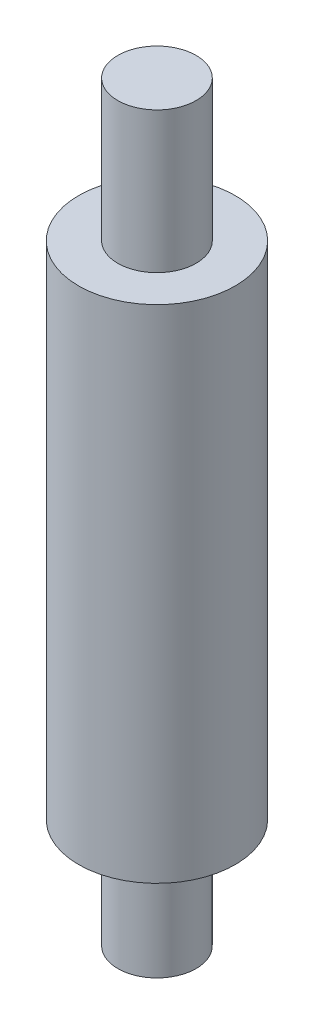
ISO-10303-21;
HEADER;
FILE_DESCRIPTION(('STEP AP214'),'2;1');
FILE_NAME('part.step','',(''),(''),'','','');
FILE_SCHEMA(('AUTOMOTIVE_DESIGN { 1 0 10303 214 1 1 1 1 }'));
ENDSEC;
DATA;
#1=APPLICATION_CONTEXT('core data for automotive mechanical design processes');
#2=APPLICATION_PROTOCOL_DEFINITION('international standard','automotive_design',2000,#1);
#3=PRODUCT_CONTEXT('',#1,'mechanical');
#4=PRODUCT('Part','Part','',(#3));
#5=PRODUCT_RELATED_PRODUCT_CATEGORY('part','',(#4));
#6=PRODUCT_DEFINITION_FORMATION('','',#4);
#7=PRODUCT_DEFINITION_CONTEXT('part definition',#1,'design');
#8=PRODUCT_DEFINITION('design','',#6,#7);
#9=PRODUCT_DEFINITION_SHAPE('','',#8);
#10=(LENGTH_UNIT() NAMED_UNIT(*) SI_UNIT(.MILLI.,.METRE.));
#11=(NAMED_UNIT(*) PLANE_ANGLE_UNIT() SI_UNIT($,.RADIAN.));
#12=(NAMED_UNIT(*) SI_UNIT($,.STERADIAN.) SOLID_ANGLE_UNIT());
#13=UNCERTAINTY_MEASURE_WITH_UNIT(LENGTH_MEASURE(1.E-05),#10,'distance_accuracy_value','');
#14=(GEOMETRIC_REPRESENTATION_CONTEXT(3) GLOBAL_UNCERTAINTY_ASSIGNED_CONTEXT((#13)) GLOBAL_UNIT_ASSIGNED_CONTEXT((#10,
#11,#12)) REPRESENTATION_CONTEXT('',''));
#15=CARTESIAN_POINT('',(0.,0.,0.));
#16=DIRECTION('',(0.,0.,1.));
#17=DIRECTION('',(1.,0.,0.));
#18=AXIS2_PLACEMENT_3D('',#15,#16,#17);
#19=CARTESIAN_POINT('',(0.,16.,0.));
#20=DIRECTION('',(0.,-1.,0.));
#21=DIRECTION('',(0.,0.,-1.));
#22=AXIS2_PLACEMENT_3D('',#19,#20,#21);
#23=CYLINDRICAL_SURFACE('',#22,2.5);
#24=CARTESIAN_POINT('',(0.,16.,0.));
#25=DIRECTION('',(0.,1.,0.));
#26=DIRECTION('',(0.,0.,1.));
#27=AXIS2_PLACEMENT_3D('',#24,#25,#26);
#28=CIRCLE('',#27,2.5);
#29=CARTESIAN_POINT('',(0.,16.,2.5));
#30=VERTEX_POINT('',#29);
#31=EDGE_CURVE('E43',#30,#30,#28,.T.);
#32=ORIENTED_EDGE('',*,*,#31,.F.);
#33=EDGE_LOOP('',(#32));
#34=FACE_BOUND('',#33,.T.);
#35=CARTESIAN_POINT('',(0.,0.,0.));
#36=DIRECTION('',(0.,1.,0.));
#37=DIRECTION('',(0.,0.,1.));
#38=AXIS2_PLACEMENT_3D('',#35,#36,#37);
#39=CIRCLE('',#38,2.5);
#40=CARTESIAN_POINT('',(0.,0.,2.5));
#41=VERTEX_POINT('',#40);
#42=EDGE_CURVE('E34',#41,#41,#39,.T.);
#43=ORIENTED_EDGE('',*,*,#42,.T.);
#44=EDGE_LOOP('',(#43));
#45=FACE_BOUND('',#44,.T.);
#46=ADVANCED_FACE('F31',(#34,#45),#23,.T.);
#47=CARTESIAN_POINT('',(0.,16.,0.));
#48=DIRECTION('',(0.,1.,0.));
#49=DIRECTION('',(0.,0.,1.));
#50=AXIS2_PLACEMENT_3D('',#47,#48,#49);
#51=PLANE('',#50);
#52=CARTESIAN_POINT('',(0.,16.,0.));
#53=DIRECTION('',(0.,1.,0.));
#54=DIRECTION('',(0.,0.,1.));
#55=AXIS2_PLACEMENT_3D('',#52,#53,#54);
#56=CIRCLE('',#55,1.25);
#57=CARTESIAN_POINT('',(0.,16.,1.25));
#58=VERTEX_POINT('',#57);
#59=EDGE_CURVE('E38',#58,#58,#56,.T.);
#60=ORIENTED_EDGE('',*,*,#59,.F.);
#61=EDGE_LOOP('',(#60));
#62=FACE_BOUND('',#61,.T.);
#63=ORIENTED_EDGE('',*,*,#31,.T.);
#64=EDGE_LOOP('',(#63));
#65=FACE_BOUND('',#64,.T.);
#66=ADVANCED_FACE('F60',(#62,#65),#51,.T.);
#67=CARTESIAN_POINT('',(0.,0.,0.));
#68=DIRECTION('',(0.,1.,0.));
#69=DIRECTION('',(0.,0.,1.));
#70=AXIS2_PLACEMENT_3D('',#67,#68,#69);
#71=PLANE('',#70);
#72=CARTESIAN_POINT('',(0.,0.,0.));
#73=DIRECTION('',(0.,-1.,0.));
#74=DIRECTION('',(0.,0.,-1.));
#75=AXIS2_PLACEMENT_3D('',#72,#73,#74);
#76=CIRCLE('',#75,1.25);
#77=CARTESIAN_POINT('',(0.,0.,-1.25));
#78=VERTEX_POINT('',#77);
#79=EDGE_CURVE('E10',#78,#78,#76,.T.);
#80=ORIENTED_EDGE('',*,*,#79,.F.);
#81=EDGE_LOOP('',(#80));
#82=FACE_BOUND('',#81,.T.);
#83=ORIENTED_EDGE('',*,*,#42,.F.);
#84=EDGE_LOOP('',(#83));
#85=FACE_BOUND('',#84,.T.);
#86=ADVANCED_FACE('F57',(#82,#85),#71,.F.);
#87=CARTESIAN_POINT('',(0.,20.5,0.));
#88=DIRECTION('',(0.,-1.,0.));
#89=DIRECTION('',(0.,0.,-1.));
#90=AXIS2_PLACEMENT_3D('',#87,#88,#89);
#91=CYLINDRICAL_SURFACE('',#90,1.25);
#92=CARTESIAN_POINT('',(0.,20.5,0.));
#93=DIRECTION('',(0.,1.,0.));
#94=DIRECTION('',(0.,0.,1.));
#95=AXIS2_PLACEMENT_3D('',#92,#93,#94);
#96=CIRCLE('',#95,1.25);
#97=CARTESIAN_POINT('',(0.,20.5,1.25));
#98=VERTEX_POINT('',#97);
#99=EDGE_CURVE('E48',#98,#98,#96,.T.);
#100=ORIENTED_EDGE('',*,*,#99,.F.);
#101=EDGE_LOOP('',(#100));
#102=FACE_BOUND('',#101,.T.);
#103=ORIENTED_EDGE('',*,*,#59,.T.);
#104=EDGE_LOOP('',(#103));
#105=FACE_BOUND('',#104,.T.);
#106=ADVANCED_FACE('F59',(#102,#105),#91,.T.);
#107=CARTESIAN_POINT('',(0.,20.5,0.));
#108=DIRECTION('',(0.,1.,0.));
#109=DIRECTION('',(0.,0.,1.));
#110=AXIS2_PLACEMENT_3D('',#107,#108,#109);
#111=PLANE('',#110);
#112=ORIENTED_EDGE('',*,*,#99,.T.);
#113=EDGE_LOOP('',(#112));
#114=FACE_BOUND('',#113,.T.);
#115=ADVANCED_FACE('F66',(#114),#111,.T.);
#116=CARTESIAN_POINT('',(0.,-3.5,0.));
#117=DIRECTION('',(0.,1.,0.));
#118=DIRECTION('',(0.,0.,1.));
#119=AXIS2_PLACEMENT_3D('',#116,#117,#118);
#120=CYLINDRICAL_SURFACE('',#119,1.25);
#121=CARTESIAN_POINT('',(0.,-3.5,0.));
#122=DIRECTION('',(0.,-1.,0.));
#123=DIRECTION('',(0.,0.,-1.));
#124=AXIS2_PLACEMENT_3D('',#121,#122,#123);
#125=CIRCLE('',#124,1.25);
#126=CARTESIAN_POINT('',(0.,-3.5,-1.25));
#127=VERTEX_POINT('',#126);
#128=EDGE_CURVE('E47',#127,#127,#125,.T.);
#129=ORIENTED_EDGE('',*,*,#128,.F.);
#130=EDGE_LOOP('',(#129));
#131=FACE_BOUND('',#130,.T.);
#132=ORIENTED_EDGE('',*,*,#79,.T.);
#133=EDGE_LOOP('',(#132));
#134=FACE_BOUND('',#133,.T.);
#135=ADVANCED_FACE('F94',(#131,#134),#120,.T.);
#136=CARTESIAN_POINT('',(0.,-3.5,0.));
#137=DIRECTION('',(0.,-1.,0.));
#138=DIRECTION('',(0.,0.,-1.));
#139=AXIS2_PLACEMENT_3D('',#136,#137,#138);
#140=PLANE('',#139);
#141=ORIENTED_EDGE('',*,*,#128,.T.);
#142=EDGE_LOOP('',(#141));
#143=FACE_BOUND('',#142,.T.);
#144=ADVANCED_FACE('F108',(#143),#140,.T.);
#145=CLOSED_SHELL('',(#46,#66,#86,#106,#115,#135,#144));
#146=MANIFOLD_SOLID_BREP('B2',#145);
#147=ADVANCED_BREP_SHAPE_REPRESENTATION('',(#18,#146),#14);
#148=SHAPE_DEFINITION_REPRESENTATION(#9,#147);
ENDSEC;
END-ISO-10303-21;
